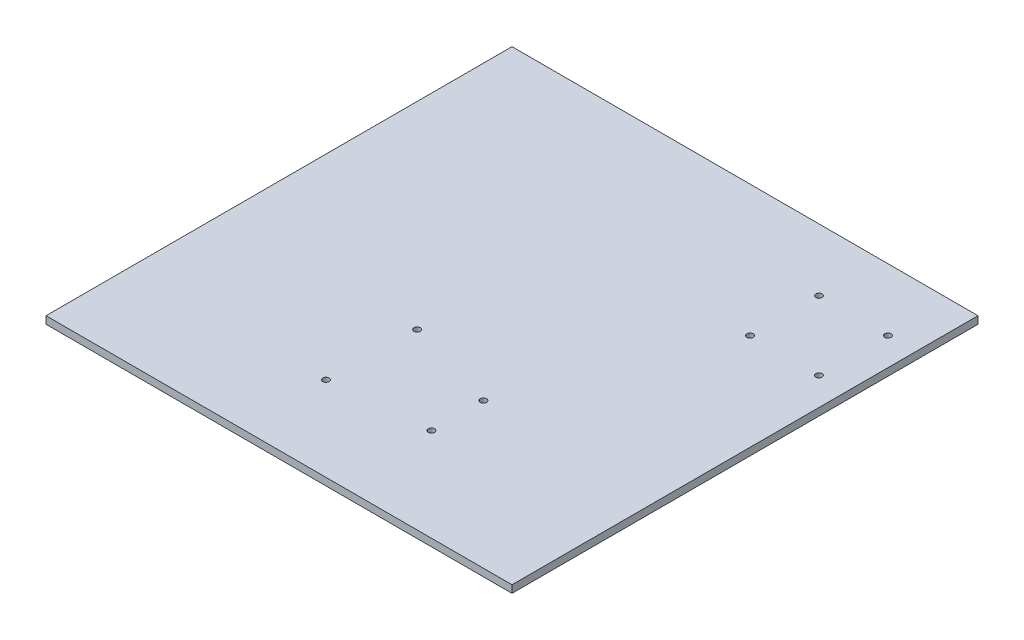
ISO-10303-21;
HEADER;
FILE_DESCRIPTION(('STEP AP214'),'2;1');
FILE_NAME('part.step','',(''),(''),'','','');
FILE_SCHEMA(('AUTOMOTIVE_DESIGN { 1 0 10303 214 1 1 1 1 }'));
ENDSEC;
DATA;
#1=APPLICATION_CONTEXT('core data for automotive mechanical design processes');
#2=APPLICATION_PROTOCOL_DEFINITION('international standard','automotive_design',2000,#1);
#3=PRODUCT_CONTEXT('',#1,'mechanical');
#4=PRODUCT('Part','Part','',(#3));
#5=PRODUCT_RELATED_PRODUCT_CATEGORY('part','',(#4));
#6=PRODUCT_DEFINITION_FORMATION('','',#4);
#7=PRODUCT_DEFINITION_CONTEXT('part definition',#1,'design');
#8=PRODUCT_DEFINITION('design','',#6,#7);
#9=PRODUCT_DEFINITION_SHAPE('','',#8);
#10=(LENGTH_UNIT() NAMED_UNIT(*) SI_UNIT(.MILLI.,.METRE.));
#11=(NAMED_UNIT(*) PLANE_ANGLE_UNIT() SI_UNIT($,.RADIAN.));
#12=(NAMED_UNIT(*) SI_UNIT($,.STERADIAN.) SOLID_ANGLE_UNIT());
#13=UNCERTAINTY_MEASURE_WITH_UNIT(LENGTH_MEASURE(1.E-05),#10,'distance_accuracy_value','');
#14=(GEOMETRIC_REPRESENTATION_CONTEXT(3) GLOBAL_UNCERTAINTY_ASSIGNED_CONTEXT((#13)) GLOBAL_UNIT_ASSIGNED_CONTEXT((#10,
#11,#12)) REPRESENTATION_CONTEXT('',''));
#15=CARTESIAN_POINT('',(0.,0.,0.));
#16=DIRECTION('',(0.,0.,1.));
#17=DIRECTION('',(1.,0.,0.));
#18=AXIS2_PLACEMENT_3D('',#15,#16,#17);
#19=CARTESIAN_POINT('',(-124.172185430464,4.,-92.3013245033113));
#20=DIRECTION('',(1.,0.,0.));
#21=DIRECTION('',(0.,0.,-1.));
#22=AXIS2_PLACEMENT_3D('',#19,#20,#21);
#23=PLANE('',#22);
#24=DIRECTION('',(0.,0.,1.));
#25=VECTOR('',#24,1.);
#26=CARTESIAN_POINT('',(-124.172185430464,0.,-92.3013245033113));
#27=LINE('',#26,#25);
#28=CARTESIAN_POINT('',(-124.172185430464,0.,-92.3013245033113));
#29=VERTEX_POINT('',#28);
#30=CARTESIAN_POINT('',(-124.172185430464,0.,157.698675496689));
#31=VERTEX_POINT('',#30);
#32=EDGE_CURVE('E95',#29,#31,#27,.T.);
#33=ORIENTED_EDGE('',*,*,#32,.T.);
#34=DIRECTION('',(0.,-1.,0.));
#35=VECTOR('',#34,1.);
#36=CARTESIAN_POINT('',(-124.172185430464,4.,157.698675496689));
#37=LINE('',#36,#35);
#38=CARTESIAN_POINT('',(-124.172185430464,4.,157.698675496689));
#39=VERTEX_POINT('',#38);
#40=EDGE_CURVE('E11',#39,#31,#37,.T.);
#41=ORIENTED_EDGE('',*,*,#40,.F.);
#42=DIRECTION('',(0.,0.,1.));
#43=VECTOR('',#42,1.);
#44=CARTESIAN_POINT('',(-124.172185430464,4.,-92.3013245033113));
#45=LINE('',#44,#43);
#46=CARTESIAN_POINT('',(-124.172185430464,4.,-92.3013245033113));
#47=VERTEX_POINT('',#46);
#48=EDGE_CURVE('E83',#47,#39,#45,.T.);
#49=ORIENTED_EDGE('',*,*,#48,.F.);
#50=DIRECTION('',(0.,-1.,0.));
#51=VECTOR('',#50,1.);
#52=CARTESIAN_POINT('',(-124.172185430464,4.,-92.3013245033113));
#53=LINE('',#52,#51);
#54=EDGE_CURVE('E91',#47,#29,#53,.T.);
#55=ORIENTED_EDGE('',*,*,#54,.T.);
#56=EDGE_LOOP('',(#33,#41,#49,#55));
#57=FACE_BOUND('',#56,.T.);
#58=ADVANCED_FACE('F32',(#57),#23,.F.);
#59=CARTESIAN_POINT('',(-124.172185430464,4.,157.698675496689));
#60=DIRECTION('',(0.,0.,-1.));
#61=DIRECTION('',(-1.,0.,0.));
#62=AXIS2_PLACEMENT_3D('',#59,#60,#61);
#63=PLANE('',#62);
#64=DIRECTION('',(1.,0.,0.));
#65=VECTOR('',#64,1.);
#66=CARTESIAN_POINT('',(-124.172185430464,0.,157.698675496689));
#67=LINE('',#66,#65);
#68=CARTESIAN_POINT('',(125.827814569536,0.,157.698675496689));
#69=VERTEX_POINT('',#68);
#70=EDGE_CURVE('E87',#31,#69,#67,.T.);
#71=ORIENTED_EDGE('',*,*,#70,.T.);
#72=DIRECTION('',(0.,-1.,0.));
#73=VECTOR('',#72,1.);
#74=CARTESIAN_POINT('',(125.827814569536,4.,157.698675496689));
#75=LINE('',#74,#73);
#76=CARTESIAN_POINT('',(125.827814569536,4.,157.698675496689));
#77=VERTEX_POINT('',#76);
#78=EDGE_CURVE('E40',#77,#69,#75,.T.);
#79=ORIENTED_EDGE('',*,*,#78,.F.);
#80=DIRECTION('',(1.,0.,0.));
#81=VECTOR('',#80,1.);
#82=CARTESIAN_POINT('',(-124.172185430464,4.,157.698675496689));
#83=LINE('',#82,#81);
#84=EDGE_CURVE('E78',#39,#77,#83,.T.);
#85=ORIENTED_EDGE('',*,*,#84,.F.);
#86=ORIENTED_EDGE('',*,*,#40,.T.);
#87=EDGE_LOOP('',(#71,#79,#85,#86));
#88=FACE_BOUND('',#87,.T.);
#89=ADVANCED_FACE('F86',(#88),#63,.F.);
#90=CARTESIAN_POINT('',(125.827814569536,4.,-92.3013245033113));
#91=DIRECTION('',(-1.,0.,0.));
#92=DIRECTION('',(0.,0.,1.));
#93=AXIS2_PLACEMENT_3D('',#90,#91,#92);
#94=PLANE('',#93);
#95=DIRECTION('',(0.,0.,-1.));
#96=VECTOR('',#95,1.);
#97=CARTESIAN_POINT('',(125.827814569536,0.,-92.3013245033113));
#98=LINE('',#97,#96);
#99=CARTESIAN_POINT('',(125.827814569536,0.,-92.3013245033113));
#100=VERTEX_POINT('',#99);
#101=EDGE_CURVE('E65',#69,#100,#98,.T.);
#102=ORIENTED_EDGE('',*,*,#101,.T.);
#103=DIRECTION('',(0.,-1.,0.));
#104=VECTOR('',#103,1.);
#105=CARTESIAN_POINT('',(125.827814569536,4.,-92.3013245033113));
#106=LINE('',#105,#104);
#107=CARTESIAN_POINT('',(125.827814569536,4.,-92.3013245033113));
#108=VERTEX_POINT('',#107);
#109=EDGE_CURVE('E88',#108,#100,#106,.T.);
#110=ORIENTED_EDGE('',*,*,#109,.F.);
#111=DIRECTION('',(0.,0.,-1.));
#112=VECTOR('',#111,1.);
#113=CARTESIAN_POINT('',(125.827814569536,4.,-92.3013245033113));
#114=LINE('',#113,#112);
#115=EDGE_CURVE('E81',#77,#108,#114,.T.);
#116=ORIENTED_EDGE('',*,*,#115,.F.);
#117=ORIENTED_EDGE('',*,*,#78,.T.);
#118=EDGE_LOOP('',(#102,#110,#116,#117));
#119=FACE_BOUND('',#118,.T.);
#120=ADVANCED_FACE('F89',(#119),#94,.F.);
#121=CARTESIAN_POINT('',(-124.172185430464,4.,-92.3013245033113));
#122=DIRECTION('',(0.,0.,1.));
#123=DIRECTION('',(1.,0.,0.));
#124=AXIS2_PLACEMENT_3D('',#121,#122,#123);
#125=PLANE('',#124);
#126=DIRECTION('',(-1.,0.,0.));
#127=VECTOR('',#126,1.);
#128=CARTESIAN_POINT('',(-124.172185430464,0.,-92.3013245033113));
#129=LINE('',#128,#127);
#130=EDGE_CURVE('E71',#100,#29,#129,.T.);
#131=ORIENTED_EDGE('',*,*,#130,.T.);
#132=ORIENTED_EDGE('',*,*,#54,.F.);
#133=DIRECTION('',(-1.,0.,0.));
#134=VECTOR('',#133,1.);
#135=CARTESIAN_POINT('',(-124.172185430464,4.,-92.3013245033113));
#136=LINE('',#135,#134);
#137=EDGE_CURVE('E48',#108,#47,#136,.T.);
#138=ORIENTED_EDGE('',*,*,#137,.F.);
#139=ORIENTED_EDGE('',*,*,#109,.T.);
#140=EDGE_LOOP('',(#131,#132,#138,#139));
#141=FACE_BOUND('',#140,.T.);
#142=ADVANCED_FACE('F103',(#141),#125,.F.);
#143=CARTESIAN_POINT('',(0.,4.,0.));
#144=DIRECTION('',(0.,1.,0.));
#145=DIRECTION('',(0.,0.,1.));
#146=AXIS2_PLACEMENT_3D('',#143,#144,#145);
#147=PLANE('',#146);
#148=CARTESIAN_POINT('',(73.8870701293229,4.,-21.9370565839553));
#149=DIRECTION('',(0.,1.,0.));
#150=DIRECTION('',(0.,0.,1.));
#151=AXIS2_PLACEMENT_3D('',#148,#149,#150);
#152=CIRCLE('',#151,1.7);
#153=CARTESIAN_POINT('',(73.8870701293229,4.,-20.2370565839553));
#154=VERTEX_POINT('',#153);
#155=EDGE_CURVE('E127',#154,#154,#152,.T.);
#156=ORIENTED_EDGE('',*,*,#155,.F.);
#157=EDGE_LOOP('',(#156));
#158=FACE_BOUND('',#157,.T.);
#159=CARTESIAN_POINT('',(32.5878145695364,4.,107.688675496689));
#160=DIRECTION('',(0.,1.,0.));
#161=DIRECTION('',(0.,0.,1.));
#162=AXIS2_PLACEMENT_3D('',#159,#160,#161);
#163=CIRCLE('',#162,1.7);
#164=CARTESIAN_POINT('',(32.5878145695364,4.,109.388675496689));
#165=VERTEX_POINT('',#164);
#166=EDGE_CURVE('E134',#165,#165,#163,.T.);
#167=ORIENTED_EDGE('',*,*,#166,.F.);
#168=EDGE_LOOP('',(#167));
#169=FACE_BOUND('',#168,.T.);
#170=CARTESIAN_POINT('',(32.5878145695364,4.,79.7886754966887));
#171=DIRECTION('',(0.,1.,0.));
#172=DIRECTION('',(0.,0.,1.));
#173=AXIS2_PLACEMENT_3D('',#170,#171,#172);
#174=CIRCLE('',#173,1.7);
#175=CARTESIAN_POINT('',(32.5878145695364,4.,81.4886754966887));
#176=VERTEX_POINT('',#175);
#177=EDGE_CURVE('E115',#176,#176,#174,.T.);
#178=ORIENTED_EDGE('',*,*,#177,.F.);
#179=EDGE_LOOP('',(#178));
#180=FACE_BOUND('',#179,.T.);
#181=CARTESIAN_POINT('',(-19.3121854304636,4.,112.388675496689));
#182=DIRECTION('',(0.,1.,0.));
#183=DIRECTION('',(0.,0.,1.));
#184=AXIS2_PLACEMENT_3D('',#181,#182,#183);
#185=CIRCLE('',#184,1.7);
#186=CARTESIAN_POINT('',(-19.3121854304636,4.,114.088675496689));
#187=VERTEX_POINT('',#186);
#188=EDGE_CURVE('E122',#187,#187,#185,.T.);
#189=ORIENTED_EDGE('',*,*,#188,.F.);
#190=EDGE_LOOP('',(#189));
#191=FACE_BOUND('',#190,.T.);
#192=CARTESIAN_POINT('',(110.887070129323,4.,-58.9370565839553));
#193=DIRECTION('',(0.,1.,0.));
#194=DIRECTION('',(0.,0.,1.));
#195=AXIS2_PLACEMENT_3D('',#192,#193,#194);
#196=CIRCLE('',#195,1.7);
#197=CARTESIAN_POINT('',(110.887070129323,4.,-57.2370565839553));
#198=VERTEX_POINT('',#197);
#199=EDGE_CURVE('E151',#198,#198,#196,.T.);
#200=ORIENTED_EDGE('',*,*,#199,.F.);
#201=EDGE_LOOP('',(#200));
#202=FACE_BOUND('',#201,.T.);
#203=CARTESIAN_POINT('',(110.887070129323,4.,-21.9370565839553));
#204=DIRECTION('',(0.,1.,0.));
#205=DIRECTION('',(0.,0.,1.));
#206=AXIS2_PLACEMENT_3D('',#203,#204,#205);
#207=CIRCLE('',#206,1.7);
#208=CARTESIAN_POINT('',(110.887070129323,4.,-20.2370565839553));
#209=VERTEX_POINT('',#208);
#210=EDGE_CURVE('E139',#209,#209,#207,.T.);
#211=ORIENTED_EDGE('',*,*,#210,.F.);
#212=EDGE_LOOP('',(#211));
#213=FACE_BOUND('',#212,.T.);
#214=CARTESIAN_POINT('',(73.8870701293229,4.,-58.9370565839553));
#215=DIRECTION('',(0.,1.,0.));
#216=DIRECTION('',(0.,0.,1.));
#217=AXIS2_PLACEMENT_3D('',#214,#215,#216);
#218=CIRCLE('',#217,1.7);
#219=CARTESIAN_POINT('',(73.8870701293229,4.,-57.2370565839553));
#220=VERTEX_POINT('',#219);
#221=EDGE_CURVE('E146',#220,#220,#218,.T.);
#222=ORIENTED_EDGE('',*,*,#221,.F.);
#223=EDGE_LOOP('',(#222));
#224=FACE_BOUND('',#223,.T.);
#225=CARTESIAN_POINT('',(-18.2121854304636,4.,64.5886754966887));
#226=DIRECTION('',(0.,1.,0.));
#227=DIRECTION('',(0.,0.,1.));
#228=AXIS2_PLACEMENT_3D('',#225,#226,#227);
#229=CIRCLE('',#228,1.7);
#230=CARTESIAN_POINT('',(-18.2121854304636,4.,66.2886754966887));
#231=VERTEX_POINT('',#230);
#232=EDGE_CURVE('E109',#231,#231,#229,.T.);
#233=ORIENTED_EDGE('',*,*,#232,.F.);
#234=EDGE_LOOP('',(#233));
#235=FACE_BOUND('',#234,.T.);
#236=ORIENTED_EDGE('',*,*,#48,.T.);
#237=ORIENTED_EDGE('',*,*,#84,.T.);
#238=ORIENTED_EDGE('',*,*,#115,.T.);
#239=ORIENTED_EDGE('',*,*,#137,.T.);
#240=EDGE_LOOP('',(#236,#237,#238,#239));
#241=FACE_BOUND('',#240,.T.);
#242=ADVANCED_FACE('F79',(#158,#169,#180,#191,#202,#213,#224,#235,#241),#147,.T.);
#243=CARTESIAN_POINT('',(0.,0.,0.));
#244=DIRECTION('',(0.,1.,0.));
#245=DIRECTION('',(0.,0.,1.));
#246=AXIS2_PLACEMENT_3D('',#243,#244,#245);
#247=PLANE('',#246);
#248=CARTESIAN_POINT('',(73.8870701293229,0.,-21.9370565839553));
#249=DIRECTION('',(0.,1.,0.));
#250=DIRECTION('',(0.,0.,1.));
#251=AXIS2_PLACEMENT_3D('',#248,#249,#250);
#252=CIRCLE('',#251,1.7);
#253=CARTESIAN_POINT('',(73.8870701293229,0.,-20.2370565839553));
#254=VERTEX_POINT('',#253);
#255=EDGE_CURVE('E130',#254,#254,#252,.T.);
#256=ORIENTED_EDGE('',*,*,#255,.T.);
#257=EDGE_LOOP('',(#256));
#258=FACE_BOUND('',#257,.T.);
#259=CARTESIAN_POINT('',(32.5878145695364,0.,107.688675496689));
#260=DIRECTION('',(0.,1.,0.));
#261=DIRECTION('',(0.,0.,1.));
#262=AXIS2_PLACEMENT_3D('',#259,#260,#261);
#263=CIRCLE('',#262,1.7);
#264=CARTESIAN_POINT('',(32.5878145695364,0.,109.388675496689));
#265=VERTEX_POINT('',#264);
#266=EDGE_CURVE('E119',#265,#265,#263,.T.);
#267=ORIENTED_EDGE('',*,*,#266,.T.);
#268=EDGE_LOOP('',(#267));
#269=FACE_BOUND('',#268,.T.);
#270=CARTESIAN_POINT('',(32.5878145695364,0.,79.7886754966887));
#271=DIRECTION('',(0.,1.,0.));
#272=DIRECTION('',(0.,0.,1.));
#273=AXIS2_PLACEMENT_3D('',#270,#271,#272);
#274=CIRCLE('',#273,1.7);
#275=CARTESIAN_POINT('',(32.5878145695364,0.,81.4886754966887));
#276=VERTEX_POINT('',#275);
#277=EDGE_CURVE('E118',#276,#276,#274,.T.);
#278=ORIENTED_EDGE('',*,*,#277,.T.);
#279=EDGE_LOOP('',(#278));
#280=FACE_BOUND('',#279,.T.);
#281=CARTESIAN_POINT('',(-19.3121854304636,0.,112.388675496689));
#282=DIRECTION('',(0.,1.,0.));
#283=DIRECTION('',(0.,0.,1.));
#284=AXIS2_PLACEMENT_3D('',#281,#282,#283);
#285=CIRCLE('',#284,1.7);
#286=CARTESIAN_POINT('',(-19.3121854304636,0.,114.088675496689));
#287=VERTEX_POINT('',#286);
#288=EDGE_CURVE('E112',#287,#287,#285,.T.);
#289=ORIENTED_EDGE('',*,*,#288,.T.);
#290=EDGE_LOOP('',(#289));
#291=FACE_BOUND('',#290,.T.);
#292=CARTESIAN_POINT('',(110.887070129323,0.,-58.9370565839553));
#293=DIRECTION('',(0.,1.,0.));
#294=DIRECTION('',(0.,0.,1.));
#295=AXIS2_PLACEMENT_3D('',#292,#293,#294);
#296=CIRCLE('',#295,1.7);
#297=CARTESIAN_POINT('',(110.887070129323,0.,-57.2370565839553));
#298=VERTEX_POINT('',#297);
#299=EDGE_CURVE('E143',#298,#298,#296,.T.);
#300=ORIENTED_EDGE('',*,*,#299,.T.);
#301=EDGE_LOOP('',(#300));
#302=FACE_BOUND('',#301,.T.);
#303=CARTESIAN_POINT('',(110.887070129323,0.,-21.9370565839553));
#304=DIRECTION('',(0.,1.,0.));
#305=DIRECTION('',(0.,0.,1.));
#306=AXIS2_PLACEMENT_3D('',#303,#304,#305);
#307=CIRCLE('',#306,1.7);
#308=CARTESIAN_POINT('',(110.887070129323,0.,-20.2370565839553));
#309=VERTEX_POINT('',#308);
#310=EDGE_CURVE('E142',#309,#309,#307,.T.);
#311=ORIENTED_EDGE('',*,*,#310,.T.);
#312=EDGE_LOOP('',(#311));
#313=FACE_BOUND('',#312,.T.);
#314=CARTESIAN_POINT('',(73.8870701293229,0.,-58.9370565839553));
#315=DIRECTION('',(0.,1.,0.));
#316=DIRECTION('',(0.,0.,1.));
#317=AXIS2_PLACEMENT_3D('',#314,#315,#316);
#318=CIRCLE('',#317,1.7);
#319=CARTESIAN_POINT('',(73.8870701293229,0.,-57.2370565839553));
#320=VERTEX_POINT('',#319);
#321=EDGE_CURVE('E131',#320,#320,#318,.T.);
#322=ORIENTED_EDGE('',*,*,#321,.T.);
#323=EDGE_LOOP('',(#322));
#324=FACE_BOUND('',#323,.T.);
#325=CARTESIAN_POINT('',(-18.2121854304636,0.,64.5886754966887));
#326=DIRECTION('',(0.,1.,0.));
#327=DIRECTION('',(0.,0.,1.));
#328=AXIS2_PLACEMENT_3D('',#325,#326,#327);
#329=CIRCLE('',#328,1.7);
#330=CARTESIAN_POINT('',(-18.2121854304636,0.,66.2886754966887));
#331=VERTEX_POINT('',#330);
#332=EDGE_CURVE('E98',#331,#331,#329,.T.);
#333=ORIENTED_EDGE('',*,*,#332,.T.);
#334=EDGE_LOOP('',(#333));
#335=FACE_BOUND('',#334,.T.);
#336=ORIENTED_EDGE('',*,*,#32,.F.);
#337=ORIENTED_EDGE('',*,*,#130,.F.);
#338=ORIENTED_EDGE('',*,*,#101,.F.);
#339=ORIENTED_EDGE('',*,*,#70,.F.);
#340=EDGE_LOOP('',(#336,#337,#338,#339));
#341=FACE_BOUND('',#340,.T.);
#342=ADVANCED_FACE('F106',(#258,#269,#280,#291,#302,#313,#324,#335,#341),#247,.F.);
#343=CARTESIAN_POINT('',(-18.2121854304636,0.,64.5886754966887));
#344=DIRECTION('',(0.,1.,0.));
#345=DIRECTION('',(0.,0.,1.));
#346=AXIS2_PLACEMENT_3D('',#343,#344,#345);
#347=CYLINDRICAL_SURFACE('',#346,1.7);
#348=ORIENTED_EDGE('',*,*,#332,.F.);
#349=EDGE_LOOP('',(#348));
#350=FACE_BOUND('',#349,.T.);
#351=ORIENTED_EDGE('',*,*,#232,.T.);
#352=EDGE_LOOP('',(#351));
#353=FACE_BOUND('',#352,.T.);
#354=ADVANCED_FACE('F177',(#350,#353),#347,.F.);
#355=CARTESIAN_POINT('',(73.8870701293229,0.,-58.9370565839553));
#356=DIRECTION('',(0.,1.,0.));
#357=DIRECTION('',(0.,0.,1.));
#358=AXIS2_PLACEMENT_3D('',#355,#356,#357);
#359=CYLINDRICAL_SURFACE('',#358,1.7);
#360=ORIENTED_EDGE('',*,*,#321,.F.);
#361=EDGE_LOOP('',(#360));
#362=FACE_BOUND('',#361,.T.);
#363=ORIENTED_EDGE('',*,*,#221,.T.);
#364=EDGE_LOOP('',(#363));
#365=FACE_BOUND('',#364,.T.);
#366=ADVANCED_FACE('F179',(#362,#365),#359,.F.);
#367=CARTESIAN_POINT('',(110.887070129323,0.,-21.9370565839553));
#368=DIRECTION('',(0.,1.,0.));
#369=DIRECTION('',(0.,0.,1.));
#370=AXIS2_PLACEMENT_3D('',#367,#368,#369);
#371=CYLINDRICAL_SURFACE('',#370,1.7);
#372=ORIENTED_EDGE('',*,*,#310,.F.);
#373=EDGE_LOOP('',(#372));
#374=FACE_BOUND('',#373,.T.);
#375=ORIENTED_EDGE('',*,*,#210,.T.);
#376=EDGE_LOOP('',(#375));
#377=FACE_BOUND('',#376,.T.);
#378=ADVANCED_FACE('F163',(#374,#377),#371,.F.);
#379=CARTESIAN_POINT('',(110.887070129323,0.,-58.9370565839553));
#380=DIRECTION('',(0.,1.,0.));
#381=DIRECTION('',(0.,0.,1.));
#382=AXIS2_PLACEMENT_3D('',#379,#380,#381);
#383=CYLINDRICAL_SURFACE('',#382,1.7);
#384=ORIENTED_EDGE('',*,*,#299,.F.);
#385=EDGE_LOOP('',(#384));
#386=FACE_BOUND('',#385,.T.);
#387=ORIENTED_EDGE('',*,*,#199,.T.);
#388=EDGE_LOOP('',(#387));
#389=FACE_BOUND('',#388,.T.);
#390=ADVANCED_FACE('F159',(#386,#389),#383,.F.);
#391=CARTESIAN_POINT('',(-19.3121854304636,0.,112.388675496689));
#392=DIRECTION('',(0.,1.,0.));
#393=DIRECTION('',(0.,0.,1.));
#394=AXIS2_PLACEMENT_3D('',#391,#392,#393);
#395=CYLINDRICAL_SURFACE('',#394,1.7);
#396=ORIENTED_EDGE('',*,*,#288,.F.);
#397=EDGE_LOOP('',(#396));
#398=FACE_BOUND('',#397,.T.);
#399=ORIENTED_EDGE('',*,*,#188,.T.);
#400=EDGE_LOOP('',(#399));
#401=FACE_BOUND('',#400,.T.);
#402=ADVANCED_FACE('F162',(#398,#401),#395,.F.);
#403=CARTESIAN_POINT('',(32.5878145695364,0.,79.7886754966887));
#404=DIRECTION('',(0.,1.,0.));
#405=DIRECTION('',(0.,0.,1.));
#406=AXIS2_PLACEMENT_3D('',#403,#404,#405);
#407=CYLINDRICAL_SURFACE('',#406,1.7);
#408=ORIENTED_EDGE('',*,*,#277,.F.);
#409=EDGE_LOOP('',(#408));
#410=FACE_BOUND('',#409,.T.);
#411=ORIENTED_EDGE('',*,*,#177,.T.);
#412=EDGE_LOOP('',(#411));
#413=FACE_BOUND('',#412,.T.);
#414=ADVANCED_FACE('F248',(#410,#413),#407,.F.);
#415=CARTESIAN_POINT('',(32.5878145695364,0.,107.688675496689));
#416=DIRECTION('',(0.,1.,0.));
#417=DIRECTION('',(0.,0.,1.));
#418=AXIS2_PLACEMENT_3D('',#415,#416,#417);
#419=CYLINDRICAL_SURFACE('',#418,1.7);
#420=ORIENTED_EDGE('',*,*,#266,.F.);
#421=EDGE_LOOP('',(#420));
#422=FACE_BOUND('',#421,.T.);
#423=ORIENTED_EDGE('',*,*,#166,.T.);
#424=EDGE_LOOP('',(#423));
#425=FACE_BOUND('',#424,.T.);
#426=ADVANCED_FACE('F258',(#422,#425),#419,.F.);
#427=CARTESIAN_POINT('',(73.8870701293229,0.,-21.9370565839553));
#428=DIRECTION('',(0.,1.,0.));
#429=DIRECTION('',(0.,0.,1.));
#430=AXIS2_PLACEMENT_3D('',#427,#428,#429);
#431=CYLINDRICAL_SURFACE('',#430,1.7);
#432=ORIENTED_EDGE('',*,*,#255,.F.);
#433=EDGE_LOOP('',(#432));
#434=FACE_BOUND('',#433,.T.);
#435=ORIENTED_EDGE('',*,*,#155,.T.);
#436=EDGE_LOOP('',(#435));
#437=FACE_BOUND('',#436,.T.);
#438=ADVANCED_FACE('F267',(#434,#437),#431,.F.);
#439=CLOSED_SHELL('',(#58,#89,#120,#142,#242,#342,#354,#366,#378,#390,#402,#414,#426,#438));
#440=MANIFOLD_SOLID_BREP('B2',#439);
#441=ADVANCED_BREP_SHAPE_REPRESENTATION('',(#18,#440),#14);
#442=SHAPE_DEFINITION_REPRESENTATION(#9,#441);
ENDSEC;
END-ISO-10303-21;
